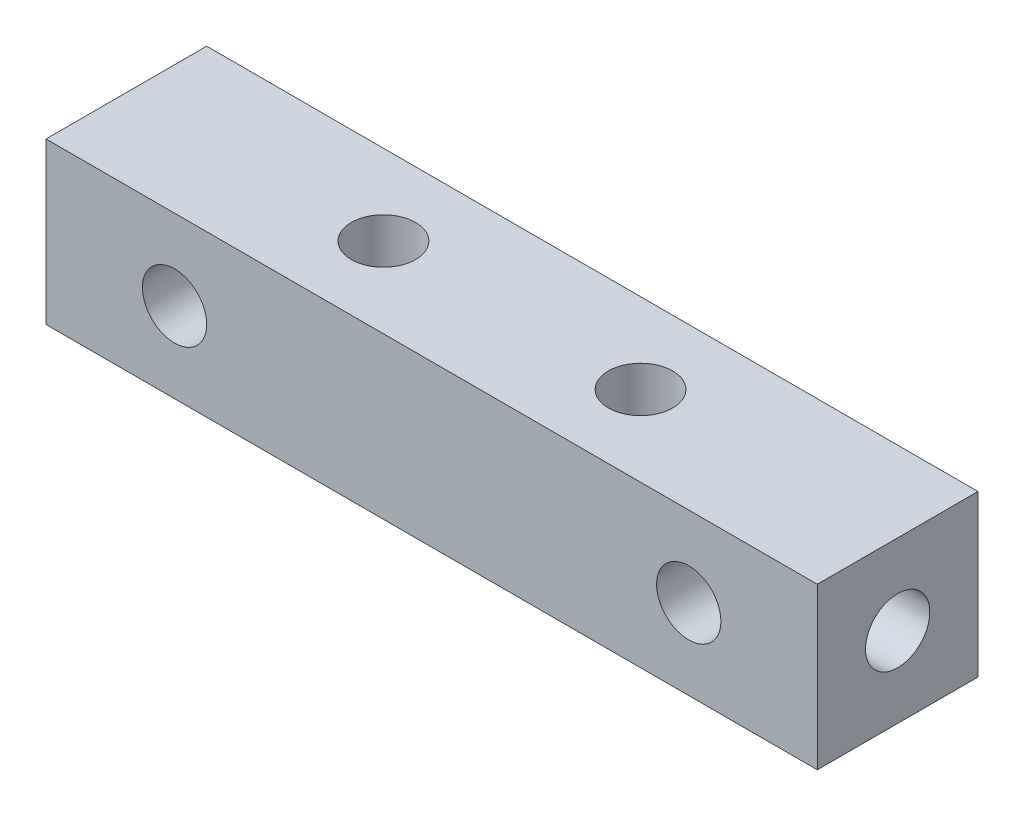
ISO-10303-21;
HEADER;
FILE_DESCRIPTION(('STEP AP214'),'2;1');
FILE_NAME('part.step','',(''),(''),'','','');
FILE_SCHEMA(('AUTOMOTIVE_DESIGN { 1 0 10303 214 1 1 1 1 }'));
ENDSEC;
DATA;
#1=APPLICATION_CONTEXT('core data for automotive mechanical design processes');
#2=APPLICATION_PROTOCOL_DEFINITION('international standard','automotive_design',2000,#1);
#3=PRODUCT_CONTEXT('',#1,'mechanical');
#4=PRODUCT('Part','Part','',(#3));
#5=PRODUCT_RELATED_PRODUCT_CATEGORY('part','',(#4));
#6=PRODUCT_DEFINITION_FORMATION('','',#4);
#7=PRODUCT_DEFINITION_CONTEXT('part definition',#1,'design');
#8=PRODUCT_DEFINITION('design','',#6,#7);
#9=PRODUCT_DEFINITION_SHAPE('','',#8);
#10=(LENGTH_UNIT() NAMED_UNIT(*) SI_UNIT(.MILLI.,.METRE.));
#11=(NAMED_UNIT(*) PLANE_ANGLE_UNIT() SI_UNIT($,.RADIAN.));
#12=(NAMED_UNIT(*) SI_UNIT($,.STERADIAN.) SOLID_ANGLE_UNIT());
#13=UNCERTAINTY_MEASURE_WITH_UNIT(LENGTH_MEASURE(1.E-05),#10,'distance_accuracy_value','');
#14=(GEOMETRIC_REPRESENTATION_CONTEXT(3) GLOBAL_UNCERTAINTY_ASSIGNED_CONTEXT((#13)) GLOBAL_UNIT_ASSIGNED_CONTEXT((#10,
#11,#12)) REPRESENTATION_CONTEXT('',''));
#15=CARTESIAN_POINT('',(0.,0.,0.));
#16=DIRECTION('',(0.,0.,1.));
#17=DIRECTION('',(1.,0.,0.));
#18=AXIS2_PLACEMENT_3D('',#15,#16,#17);
#19=CARTESIAN_POINT('',(16.,5.,-5.));
#20=DIRECTION('',(0.,0.,1.));
#21=DIRECTION('',(1.,0.,0.));
#22=AXIS2_PLACEMENT_3D('',#19,#20,#21);
#23=CYLINDRICAL_SURFACE('',#22,2.);
#24=CARTESIAN_POINT('',(16.,5.,5.));
#25=DIRECTION('',(0.,0.,1.));
#26=DIRECTION('',(1.,0.,0.));
#27=AXIS2_PLACEMENT_3D('',#24,#25,#26);
#28=CIRCLE('',#27,2.);
#29=CARTESIAN_POINT('',(18.,5.,5.));
#30=VERTEX_POINT('',#29);
#31=EDGE_CURVE('E211',#30,#30,#28,.T.);
#32=ORIENTED_EDGE('',*,*,#31,.T.);
#33=EDGE_LOOP('',(#32));
#34=FACE_BOUND('',#33,.T.);
#35=CARTESIAN_POINT('',(16.,5.,-5.));
#36=DIRECTION('',(0.,0.,1.));
#37=DIRECTION('',(1.,0.,0.));
#38=AXIS2_PLACEMENT_3D('',#35,#36,#37);
#39=CIRCLE('',#38,2.);
#40=CARTESIAN_POINT('',(18.,5.,-5.));
#41=VERTEX_POINT('',#40);
#42=EDGE_CURVE('E135',#41,#41,#39,.T.);
#43=ORIENTED_EDGE('',*,*,#42,.F.);
#44=EDGE_LOOP('',(#43));
#45=FACE_BOUND('',#44,.T.);
#46=CARTESIAN_POINT('',(16.,5.,0.));
#47=DIRECTION('',(0.707106781186548,0.,0.707106781186547));
#48=DIRECTION('',(-0.707106781186547,0.,0.707106781186548));
#49=AXIS2_PLACEMENT_3D('',#46,#47,#48);
#50=ELLIPSE('',#49,2.82842712474619,2.);
#51=CARTESIAN_POINT('',(16.,7.,0.));
#52=VERTEX_POINT('',#51);
#53=CARTESIAN_POINT('',(16.,3.,0.));
#54=VERTEX_POINT('',#53);
#55=EDGE_CURVE('E11',#52,#54,#50,.F.);
#56=ORIENTED_EDGE('',*,*,#55,.F.);
#57=CARTESIAN_POINT('',(16.,5.,0.));
#58=DIRECTION('',(-0.707106781186547,0.,0.707106781186548));
#59=DIRECTION('',(0.707106781186548,0.,0.707106781186547));
#60=AXIS2_PLACEMENT_3D('',#57,#58,#59);
#61=ELLIPSE('',#60,2.82842712474619,2.);
#62=EDGE_CURVE('E47',#54,#52,#61,.T.);
#63=ORIENTED_EDGE('',*,*,#62,.F.);
#64=EDGE_LOOP('',(#56,#63));
#65=FACE_BOUND('',#64,.T.);
#66=ADVANCED_FACE('F41',(#34,#45,#65),#23,.F.);
#67=CARTESIAN_POINT('',(24.,10.,-5.));
#68=DIRECTION('',(-1.,0.,0.));
#69=DIRECTION('',(0.,0.,1.));
#70=AXIS2_PLACEMENT_3D('',#67,#68,#69);
#71=PLANE('',#70);
#72=CARTESIAN_POINT('',(24.,5.,0.));
#73=DIRECTION('',(-1.,0.,0.));
#74=DIRECTION('',(0.,0.,1.));
#75=AXIS2_PLACEMENT_3D('',#72,#73,#74);
#76=CIRCLE('',#75,2.);
#77=CARTESIAN_POINT('',(24.,5.,2.));
#78=VERTEX_POINT('',#77);
#79=EDGE_CURVE('E227',#78,#78,#76,.T.);
#80=ORIENTED_EDGE('',*,*,#79,.T.);
#81=EDGE_LOOP('',(#80));
#82=FACE_BOUND('',#81,.T.);
#83=DIRECTION('',(0.,0.,-1.));
#84=VECTOR('',#83,1.);
#85=CARTESIAN_POINT('',(24.,0.,-5.));
#86=LINE('',#85,#84);
#87=CARTESIAN_POINT('',(24.,0.,5.));
#88=VERTEX_POINT('',#87);
#89=CARTESIAN_POINT('',(24.,0.,-5.));
#90=VERTEX_POINT('',#89);
#91=EDGE_CURVE('E148',#88,#90,#86,.T.);
#92=ORIENTED_EDGE('',*,*,#91,.T.);
#93=DIRECTION('',(0.,-1.,0.));
#94=VECTOR('',#93,1.);
#95=CARTESIAN_POINT('',(24.,10.,-5.));
#96=LINE('',#95,#94);
#97=CARTESIAN_POINT('',(24.,10.,-5.));
#98=VERTEX_POINT('',#97);
#99=EDGE_CURVE('E138',#98,#90,#96,.T.);
#100=ORIENTED_EDGE('',*,*,#99,.F.);
#101=DIRECTION('',(0.,0.,-1.));
#102=VECTOR('',#101,1.);
#103=CARTESIAN_POINT('',(24.,10.,-5.));
#104=LINE('',#103,#102);
#105=CARTESIAN_POINT('',(24.,10.,5.));
#106=VERTEX_POINT('',#105);
#107=EDGE_CURVE('E160',#106,#98,#104,.T.);
#108=ORIENTED_EDGE('',*,*,#107,.F.);
#109=DIRECTION('',(0.,-1.,0.));
#110=VECTOR('',#109,1.);
#111=CARTESIAN_POINT('',(24.,10.,5.));
#112=LINE('',#111,#110);
#113=EDGE_CURVE('E161',#106,#88,#112,.T.);
#114=ORIENTED_EDGE('',*,*,#113,.T.);
#115=EDGE_LOOP('',(#92,#100,#108,#114));
#116=FACE_BOUND('',#115,.T.);
#117=ADVANCED_FACE('F43',(#82,#116),#71,.F.);
#118=CARTESIAN_POINT('',(-24.,10.,-5.));
#119=DIRECTION('',(0.,0.,1.));
#120=DIRECTION('',(1.,0.,0.));
#121=AXIS2_PLACEMENT_3D('',#118,#119,#120);
#122=PLANE('',#121);
#123=CARTESIAN_POINT('',(-16.,5.,-5.));
#124=DIRECTION('',(0.,0.,1.));
#125=DIRECTION('',(1.,0.,0.));
#126=AXIS2_PLACEMENT_3D('',#123,#124,#125);
#127=CIRCLE('',#126,2.);
#128=CARTESIAN_POINT('',(-14.,5.,-5.));
#129=VERTEX_POINT('',#128);
#130=EDGE_CURVE('E126',#129,#129,#127,.T.);
#131=ORIENTED_EDGE('',*,*,#130,.T.);
#132=EDGE_LOOP('',(#131));
#133=FACE_BOUND('',#132,.T.);
#134=ORIENTED_EDGE('',*,*,#42,.T.);
#135=EDGE_LOOP('',(#134));
#136=FACE_BOUND('',#135,.T.);
#137=DIRECTION('',(-1.,0.,0.));
#138=VECTOR('',#137,1.);
#139=CARTESIAN_POINT('',(-24.,0.,-5.));
#140=LINE('',#139,#138);
#141=CARTESIAN_POINT('',(-24.,0.,-5.));
#142=VERTEX_POINT('',#141);
#143=EDGE_CURVE('E134',#90,#142,#140,.T.);
#144=ORIENTED_EDGE('',*,*,#143,.T.);
#145=DIRECTION('',(0.,-1.,0.));
#146=VECTOR('',#145,1.);
#147=CARTESIAN_POINT('',(-24.,10.,-5.));
#148=LINE('',#147,#146);
#149=CARTESIAN_POINT('',(-24.,10.,-5.));
#150=VERTEX_POINT('',#149);
#151=EDGE_CURVE('E139',#150,#142,#148,.T.);
#152=ORIENTED_EDGE('',*,*,#151,.F.);
#153=DIRECTION('',(-1.,0.,0.));
#154=VECTOR('',#153,1.);
#155=CARTESIAN_POINT('',(-24.,10.,-5.));
#156=LINE('',#155,#154);
#157=EDGE_CURVE('E216',#98,#150,#156,.T.);
#158=ORIENTED_EDGE('',*,*,#157,.F.);
#159=ORIENTED_EDGE('',*,*,#99,.T.);
#160=EDGE_LOOP('',(#144,#152,#158,#159));
#161=FACE_BOUND('',#160,.T.);
#162=ADVANCED_FACE('F98',(#133,#136,#161),#122,.F.);
#163=CARTESIAN_POINT('',(-24.,10.,-5.));
#164=DIRECTION('',(1.,0.,0.));
#165=DIRECTION('',(0.,0.,-1.));
#166=AXIS2_PLACEMENT_3D('',#163,#164,#165);
#167=PLANE('',#166);
#168=CARTESIAN_POINT('',(-24.,5.,0.));
#169=DIRECTION('',(-1.,0.,0.));
#170=DIRECTION('',(0.,0.,1.));
#171=AXIS2_PLACEMENT_3D('',#168,#169,#170);
#172=CIRCLE('',#171,2.);
#173=CARTESIAN_POINT('',(-24.,5.,2.));
#174=VERTEX_POINT('',#173);
#175=EDGE_CURVE('E201',#174,#174,#172,.T.);
#176=ORIENTED_EDGE('',*,*,#175,.F.);
#177=EDGE_LOOP('',(#176));
#178=FACE_BOUND('',#177,.T.);
#179=DIRECTION('',(0.,0.,1.));
#180=VECTOR('',#179,1.);
#181=CARTESIAN_POINT('',(-24.,0.,-5.));
#182=LINE('',#181,#180);
#183=CARTESIAN_POINT('',(-24.,0.,5.));
#184=VERTEX_POINT('',#183);
#185=EDGE_CURVE('E144',#142,#184,#182,.T.);
#186=ORIENTED_EDGE('',*,*,#185,.T.);
#187=DIRECTION('',(0.,-1.,0.));
#188=VECTOR('',#187,1.);
#189=CARTESIAN_POINT('',(-24.,10.,5.));
#190=LINE('',#189,#188);
#191=CARTESIAN_POINT('',(-24.,10.,5.));
#192=VERTEX_POINT('',#191);
#193=EDGE_CURVE('E155',#192,#184,#190,.T.);
#194=ORIENTED_EDGE('',*,*,#193,.F.);
#195=DIRECTION('',(0.,0.,1.));
#196=VECTOR('',#195,1.);
#197=CARTESIAN_POINT('',(-24.,10.,-5.));
#198=LINE('',#197,#196);
#199=EDGE_CURVE('E151',#150,#192,#198,.T.);
#200=ORIENTED_EDGE('',*,*,#199,.F.);
#201=ORIENTED_EDGE('',*,*,#151,.T.);
#202=EDGE_LOOP('',(#186,#194,#200,#201));
#203=FACE_BOUND('',#202,.T.);
#204=ADVANCED_FACE('F120',(#178,#203),#167,.F.);
#205=CARTESIAN_POINT('',(-24.,10.,5.));
#206=DIRECTION('',(0.,0.,-1.));
#207=DIRECTION('',(-1.,0.,0.));
#208=AXIS2_PLACEMENT_3D('',#205,#206,#207);
#209=PLANE('',#208);
#210=CARTESIAN_POINT('',(-16.,5.,5.));
#211=DIRECTION('',(0.,0.,1.));
#212=DIRECTION('',(1.,0.,0.));
#213=AXIS2_PLACEMENT_3D('',#210,#211,#212);
#214=CIRCLE('',#213,2.);
#215=CARTESIAN_POINT('',(-14.,5.,5.));
#216=VERTEX_POINT('',#215);
#217=EDGE_CURVE('E208',#216,#216,#214,.T.);
#218=ORIENTED_EDGE('',*,*,#217,.F.);
#219=EDGE_LOOP('',(#218));
#220=FACE_BOUND('',#219,.T.);
#221=ORIENTED_EDGE('',*,*,#31,.F.);
#222=EDGE_LOOP('',(#221));
#223=FACE_BOUND('',#222,.T.);
#224=DIRECTION('',(1.,0.,0.));
#225=VECTOR('',#224,1.);
#226=CARTESIAN_POINT('',(-24.,0.,5.));
#227=LINE('',#226,#225);
#228=EDGE_CURVE('E154',#184,#88,#227,.T.);
#229=ORIENTED_EDGE('',*,*,#228,.T.);
#230=ORIENTED_EDGE('',*,*,#113,.F.);
#231=DIRECTION('',(1.,0.,0.));
#232=VECTOR('',#231,1.);
#233=CARTESIAN_POINT('',(-24.,10.,5.));
#234=LINE('',#233,#232);
#235=EDGE_CURVE('E163',#192,#106,#234,.T.);
#236=ORIENTED_EDGE('',*,*,#235,.F.);
#237=ORIENTED_EDGE('',*,*,#193,.T.);
#238=EDGE_LOOP('',(#229,#230,#236,#237));
#239=FACE_BOUND('',#238,.T.);
#240=ADVANCED_FACE('F109',(#220,#223,#239),#209,.F.);
#241=CARTESIAN_POINT('',(0.,10.,0.));
#242=DIRECTION('',(0.,1.,0.));
#243=DIRECTION('',(0.,0.,1.));
#244=AXIS2_PLACEMENT_3D('',#241,#242,#243);
#245=PLANE('',#244);
#246=CARTESIAN_POINT('',(-8.,10.,0.));
#247=DIRECTION('',(0.,1.,0.));
#248=DIRECTION('',(0.,0.,1.));
#249=AXIS2_PLACEMENT_3D('',#246,#247,#248);
#250=CIRCLE('',#249,2.);
#251=CARTESIAN_POINT('',(-8.,10.,2.));
#252=VERTEX_POINT('',#251);
#253=EDGE_CURVE('E196',#252,#252,#250,.T.);
#254=ORIENTED_EDGE('',*,*,#253,.F.);
#255=EDGE_LOOP('',(#254));
#256=FACE_BOUND('',#255,.T.);
#257=CARTESIAN_POINT('',(8.,10.,0.));
#258=DIRECTION('',(0.,1.,0.));
#259=DIRECTION('',(0.,0.,1.));
#260=AXIS2_PLACEMENT_3D('',#257,#258,#259);
#261=CIRCLE('',#260,2.);
#262=CARTESIAN_POINT('',(8.,10.,2.));
#263=VERTEX_POINT('',#262);
#264=EDGE_CURVE('E198',#263,#263,#261,.T.);
#265=ORIENTED_EDGE('',*,*,#264,.F.);
#266=EDGE_LOOP('',(#265));
#267=FACE_BOUND('',#266,.T.);
#268=ORIENTED_EDGE('',*,*,#107,.T.);
#269=ORIENTED_EDGE('',*,*,#157,.T.);
#270=ORIENTED_EDGE('',*,*,#199,.T.);
#271=ORIENTED_EDGE('',*,*,#235,.T.);
#272=EDGE_LOOP('',(#268,#269,#270,#271));
#273=FACE_BOUND('',#272,.T.);
#274=ADVANCED_FACE('F106',(#256,#267,#273),#245,.T.);
#275=CARTESIAN_POINT('',(0.,0.,0.));
#276=DIRECTION('',(0.,1.,0.));
#277=DIRECTION('',(0.,0.,1.));
#278=AXIS2_PLACEMENT_3D('',#275,#276,#277);
#279=PLANE('',#278);
#280=CARTESIAN_POINT('',(-8.,0.,0.));
#281=DIRECTION('',(0.,1.,0.));
#282=DIRECTION('',(0.,0.,1.));
#283=AXIS2_PLACEMENT_3D('',#280,#281,#282);
#284=CIRCLE('',#283,2.);
#285=CARTESIAN_POINT('',(-8.,0.,2.));
#286=VERTEX_POINT('',#285);
#287=EDGE_CURVE('E203',#286,#286,#284,.T.);
#288=ORIENTED_EDGE('',*,*,#287,.T.);
#289=EDGE_LOOP('',(#288));
#290=FACE_BOUND('',#289,.T.);
#291=CARTESIAN_POINT('',(8.,0.,0.));
#292=DIRECTION('',(0.,1.,0.));
#293=DIRECTION('',(0.,0.,1.));
#294=AXIS2_PLACEMENT_3D('',#291,#292,#293);
#295=CIRCLE('',#294,2.);
#296=CARTESIAN_POINT('',(8.,0.,2.));
#297=VERTEX_POINT('',#296);
#298=EDGE_CURVE('E195',#297,#297,#295,.T.);
#299=ORIENTED_EDGE('',*,*,#298,.T.);
#300=EDGE_LOOP('',(#299));
#301=FACE_BOUND('',#300,.T.);
#302=ORIENTED_EDGE('',*,*,#91,.F.);
#303=ORIENTED_EDGE('',*,*,#228,.F.);
#304=ORIENTED_EDGE('',*,*,#185,.F.);
#305=ORIENTED_EDGE('',*,*,#143,.F.);
#306=EDGE_LOOP('',(#302,#303,#304,#305));
#307=FACE_BOUND('',#306,.T.);
#308=ADVANCED_FACE('F108',(#290,#301,#307),#279,.F.);
#309=CARTESIAN_POINT('',(-16.,5.,-5.));
#310=DIRECTION('',(0.,0.,1.));
#311=DIRECTION('',(1.,0.,0.));
#312=AXIS2_PLACEMENT_3D('',#309,#310,#311);
#313=CYLINDRICAL_SURFACE('',#312,2.);
#314=CARTESIAN_POINT('',(-16.,5.,0.));
#315=DIRECTION('',(0.707106781186547,0.,0.707106781186548));
#316=DIRECTION('',(-0.707106781186548,0.,0.707106781186547));
#317=AXIS2_PLACEMENT_3D('',#314,#315,#316);
#318=ELLIPSE('',#317,2.82842712474619,2.);
#319=CARTESIAN_POINT('',(-16.,3.,0.));
#320=VERTEX_POINT('',#319);
#321=CARTESIAN_POINT('',(-16.,7.,0.));
#322=VERTEX_POINT('',#321);
#323=EDGE_CURVE('E170',#320,#322,#318,.F.);
#324=ORIENTED_EDGE('',*,*,#323,.T.);
#325=CARTESIAN_POINT('',(-16.,5.,0.));
#326=DIRECTION('',(-0.707106781186548,0.,0.707106781186547));
#327=DIRECTION('',(0.707106781186547,0.,0.707106781186548));
#328=AXIS2_PLACEMENT_3D('',#325,#326,#327);
#329=ELLIPSE('',#328,2.82842712474619,2.);
#330=EDGE_CURVE('E58',#322,#320,#329,.T.);
#331=ORIENTED_EDGE('',*,*,#330,.T.);
#332=EDGE_LOOP('',(#324,#331));
#333=FACE_BOUND('',#332,.T.);
#334=ORIENTED_EDGE('',*,*,#130,.F.);
#335=EDGE_LOOP('',(#334));
#336=FACE_BOUND('',#335,.T.);
#337=ORIENTED_EDGE('',*,*,#217,.T.);
#338=EDGE_LOOP('',(#337));
#339=FACE_BOUND('',#338,.T.);
#340=ADVANCED_FACE('F102',(#333,#336,#339),#313,.F.);
#341=CARTESIAN_POINT('',(8.,0.,0.));
#342=DIRECTION('',(0.,1.,0.));
#343=DIRECTION('',(0.,0.,1.));
#344=AXIS2_PLACEMENT_3D('',#341,#342,#343);
#345=CYLINDRICAL_SURFACE('',#344,2.);
#346=ORIENTED_EDGE('',*,*,#298,.F.);
#347=EDGE_LOOP('',(#346));
#348=FACE_BOUND('',#347,.T.);
#349=ORIENTED_EDGE('',*,*,#264,.T.);
#350=EDGE_LOOP('',(#349));
#351=FACE_BOUND('',#350,.T.);
#352=ADVANCED_FACE('F185',(#348,#351),#345,.F.);
#353=CARTESIAN_POINT('',(-8.,0.,0.));
#354=DIRECTION('',(0.,1.,0.));
#355=DIRECTION('',(0.,0.,1.));
#356=AXIS2_PLACEMENT_3D('',#353,#354,#355);
#357=CYLINDRICAL_SURFACE('',#356,2.);
#358=ORIENTED_EDGE('',*,*,#287,.F.);
#359=EDGE_LOOP('',(#358));
#360=FACE_BOUND('',#359,.T.);
#361=ORIENTED_EDGE('',*,*,#253,.T.);
#362=EDGE_LOOP('',(#361));
#363=FACE_BOUND('',#362,.T.);
#364=ADVANCED_FACE('F175',(#360,#363),#357,.F.);
#365=CARTESIAN_POINT('',(-16.,5.,0.));
#366=DIRECTION('',(-1.,0.,0.));
#367=DIRECTION('',(0.,0.,1.));
#368=AXIS2_PLACEMENT_3D('',#365,#366,#367);
#369=CYLINDRICAL_SURFACE('',#368,2.);
#370=ORIENTED_EDGE('',*,*,#175,.T.);
#371=EDGE_LOOP('',(#370));
#372=FACE_BOUND('',#371,.T.);
#373=ORIENTED_EDGE('',*,*,#323,.F.);
#374=ORIENTED_EDGE('',*,*,#330,.F.);
#375=EDGE_LOOP('',(#373,#374));
#376=FACE_BOUND('',#375,.T.);
#377=ADVANCED_FACE('F173',(#372,#376),#369,.F.);
#378=CARTESIAN_POINT('',(16.,5.,0.));
#379=DIRECTION('',(1.,0.,0.));
#380=DIRECTION('',(0.,0.,-1.));
#381=AXIS2_PLACEMENT_3D('',#378,#379,#380);
#382=CYLINDRICAL_SURFACE('',#381,2.);
#383=ORIENTED_EDGE('',*,*,#79,.F.);
#384=EDGE_LOOP('',(#383));
#385=FACE_BOUND('',#384,.T.);
#386=ORIENTED_EDGE('',*,*,#55,.T.);
#387=ORIENTED_EDGE('',*,*,#62,.T.);
#388=EDGE_LOOP('',(#386,#387));
#389=FACE_BOUND('',#388,.T.);
#390=ADVANCED_FACE('F90',(#385,#389),#382,.F.);
#391=CLOSED_SHELL('',(#66,#117,#162,#204,#240,#274,#308,#340,#352,#364,#377,#390));
#392=MANIFOLD_SOLID_BREP('B2',#391);
#393=ADVANCED_BREP_SHAPE_REPRESENTATION('',(#18,#392),#14);
#394=SHAPE_DEFINITION_REPRESENTATION(#9,#393);
ENDSEC;
END-ISO-10303-21;
